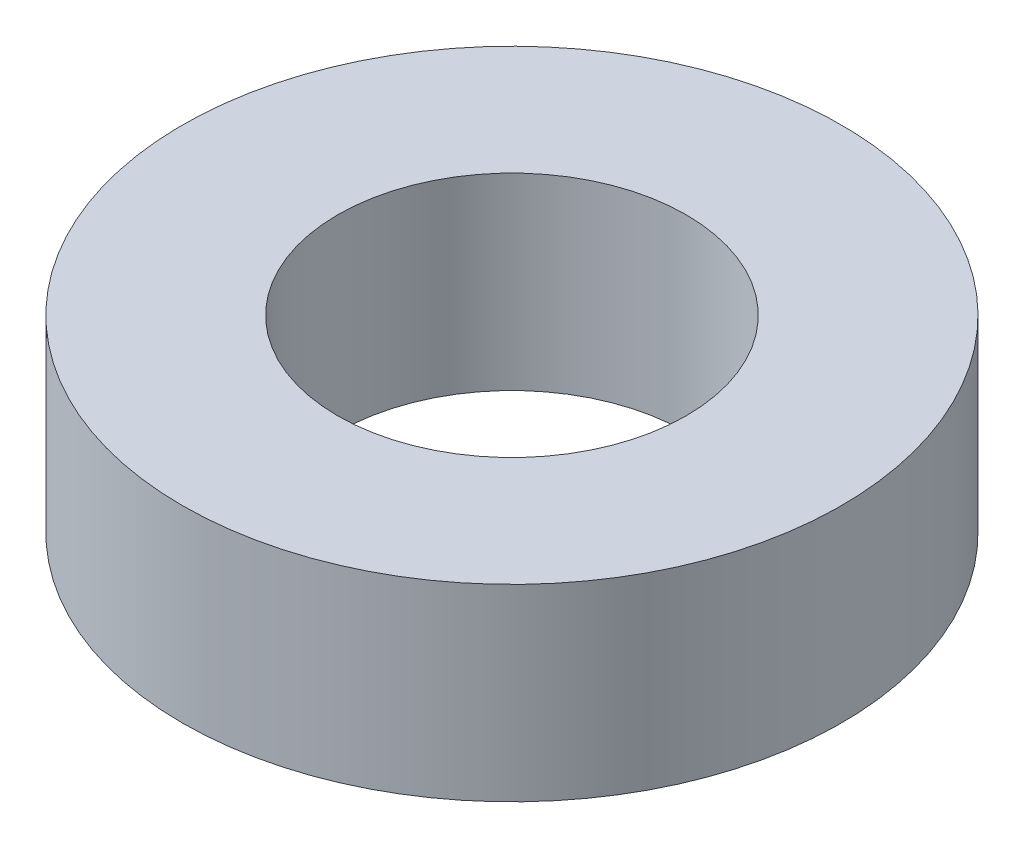
ISO-10303-21;
HEADER;
FILE_DESCRIPTION(('STEP AP214'),'2;1');
FILE_NAME('part.step','',(''),(''),'','','');
FILE_SCHEMA(('AUTOMOTIVE_DESIGN { 1 0 10303 214 1 1 1 1 }'));
ENDSEC;
DATA;
#1=APPLICATION_CONTEXT('core data for automotive mechanical design processes');
#2=APPLICATION_PROTOCOL_DEFINITION('international standard','automotive_design',2000,#1);
#3=PRODUCT_CONTEXT('',#1,'mechanical');
#4=PRODUCT('Part','Part','',(#3));
#5=PRODUCT_RELATED_PRODUCT_CATEGORY('part','',(#4));
#6=PRODUCT_DEFINITION_FORMATION('','',#4);
#7=PRODUCT_DEFINITION_CONTEXT('part definition',#1,'design');
#8=PRODUCT_DEFINITION('design','',#6,#7);
#9=PRODUCT_DEFINITION_SHAPE('','',#8);
#10=(LENGTH_UNIT() NAMED_UNIT(*) SI_UNIT(.MILLI.,.METRE.));
#11=(NAMED_UNIT(*) PLANE_ANGLE_UNIT() SI_UNIT($,.RADIAN.));
#12=(NAMED_UNIT(*) SI_UNIT($,.STERADIAN.) SOLID_ANGLE_UNIT());
#13=UNCERTAINTY_MEASURE_WITH_UNIT(LENGTH_MEASURE(1.E-05),#10,'distance_accuracy_value','');
#14=(GEOMETRIC_REPRESENTATION_CONTEXT(3) GLOBAL_UNCERTAINTY_ASSIGNED_CONTEXT((#13)) GLOBAL_UNIT_ASSIGNED_CONTEXT((#10,
#11,#12)) REPRESENTATION_CONTEXT('',''));
#15=CARTESIAN_POINT('',(0.,0.,0.));
#16=DIRECTION('',(0.,0.,1.));
#17=DIRECTION('',(1.,0.,0.));
#18=AXIS2_PLACEMENT_3D('',#15,#16,#17);
#19=CARTESIAN_POINT('',(0.,2.,0.));
#20=DIRECTION('',(0.,1.,0.));
#21=DIRECTION('',(0.,0.,1.));
#22=AXIS2_PLACEMENT_3D('',#19,#20,#21);
#23=PLANE('',#22);
#24=CARTESIAN_POINT('',(0.,2.,0.));
#25=DIRECTION('',(0.,1.,0.));
#26=DIRECTION('',(0.,0.,1.));
#27=AXIS2_PLACEMENT_3D('',#24,#25,#26);
#28=CIRCLE('',#27,3.5);
#29=CARTESIAN_POINT('',(0.,2.,3.5));
#30=VERTEX_POINT('',#29);
#31=EDGE_CURVE('E10',#30,#30,#28,.T.);
#32=ORIENTED_EDGE('',*,*,#31,.T.);
#33=EDGE_LOOP('',(#32));
#34=FACE_BOUND('',#33,.T.);
#35=CARTESIAN_POINT('',(0.,2.,0.));
#36=DIRECTION('',(0.,1.,0.));
#37=DIRECTION('',(0.,0.,1.));
#38=AXIS2_PLACEMENT_3D('',#35,#36,#37);
#39=CIRCLE('',#38,1.85);
#40=CARTESIAN_POINT('',(0.,2.,1.85));
#41=VERTEX_POINT('',#40);
#42=EDGE_CURVE('E43',#41,#41,#39,.T.);
#43=ORIENTED_EDGE('',*,*,#42,.F.);
#44=EDGE_LOOP('',(#43));
#45=FACE_BOUND('',#44,.T.);
#46=ADVANCED_FACE('F32',(#34,#45),#23,.T.);
#47=CARTESIAN_POINT('',(0.,0.,0.));
#48=DIRECTION('',(0.,1.,0.));
#49=DIRECTION('',(0.,0.,1.));
#50=AXIS2_PLACEMENT_3D('',#47,#48,#49);
#51=PLANE('',#50);
#52=CARTESIAN_POINT('',(0.,0.,0.));
#53=DIRECTION('',(0.,1.,0.));
#54=DIRECTION('',(0.,0.,1.));
#55=AXIS2_PLACEMENT_3D('',#52,#53,#54);
#56=CIRCLE('',#55,3.5);
#57=CARTESIAN_POINT('',(0.,0.,3.5));
#58=VERTEX_POINT('',#57);
#59=EDGE_CURVE('E36',#58,#58,#56,.T.);
#60=ORIENTED_EDGE('',*,*,#59,.F.);
#61=EDGE_LOOP('',(#60));
#62=FACE_BOUND('',#61,.T.);
#63=CARTESIAN_POINT('',(0.,0.,0.));
#64=DIRECTION('',(0.,1.,0.));
#65=DIRECTION('',(0.,0.,1.));
#66=AXIS2_PLACEMENT_3D('',#63,#64,#65);
#67=CIRCLE('',#66,1.85);
#68=CARTESIAN_POINT('',(0.,0.,1.85));
#69=VERTEX_POINT('',#68);
#70=EDGE_CURVE('E45',#69,#69,#67,.T.);
#71=ORIENTED_EDGE('',*,*,#70,.T.);
#72=EDGE_LOOP('',(#71));
#73=FACE_BOUND('',#72,.T.);
#74=ADVANCED_FACE('F55',(#62,#73),#51,.F.);
#75=CARTESIAN_POINT('',(0.,2.,0.));
#76=DIRECTION('',(0.,-1.,0.));
#77=DIRECTION('',(0.,0.,-1.));
#78=AXIS2_PLACEMENT_3D('',#75,#76,#77);
#79=CYLINDRICAL_SURFACE('',#78,3.5);
#80=ORIENTED_EDGE('',*,*,#31,.F.);
#81=EDGE_LOOP('',(#80));
#82=FACE_BOUND('',#81,.T.);
#83=ORIENTED_EDGE('',*,*,#59,.T.);
#84=EDGE_LOOP('',(#83));
#85=FACE_BOUND('',#84,.T.);
#86=ADVANCED_FACE('F34',(#82,#85),#79,.T.);
#87=CARTESIAN_POINT('',(0.,2.,0.));
#88=DIRECTION('',(0.,-1.,0.));
#89=DIRECTION('',(0.,0.,-1.));
#90=AXIS2_PLACEMENT_3D('',#87,#88,#89);
#91=CYLINDRICAL_SURFACE('',#90,1.85);
#92=ORIENTED_EDGE('',*,*,#42,.T.);
#93=EDGE_LOOP('',(#92));
#94=FACE_BOUND('',#93,.T.);
#95=ORIENTED_EDGE('',*,*,#70,.F.);
#96=EDGE_LOOP('',(#95));
#97=FACE_BOUND('',#96,.T.);
#98=ADVANCED_FACE('F51',(#94,#97),#91,.F.);
#99=CLOSED_SHELL('',(#46,#74,#86,#98));
#100=MANIFOLD_SOLID_BREP('B2',#99);
#101=ADVANCED_BREP_SHAPE_REPRESENTATION('',(#18,#100),#14);
#102=SHAPE_DEFINITION_REPRESENTATION(#9,#101);
ENDSEC;
END-ISO-10303-21;
